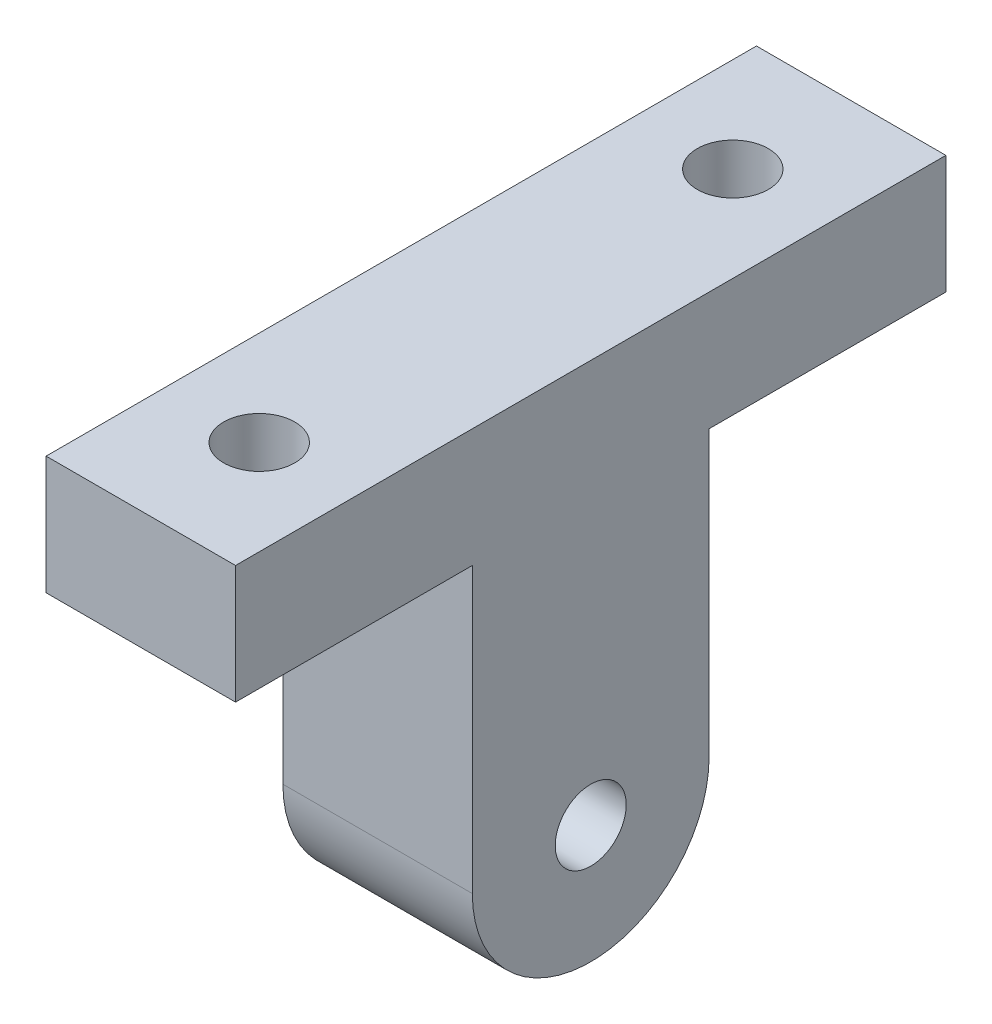
ISO-10303-21;
HEADER;
FILE_DESCRIPTION(('STEP AP214'),'2;1');
FILE_NAME('part.step','',(''),(''),'','','');
FILE_SCHEMA(('AUTOMOTIVE_DESIGN { 1 0 10303 214 1 1 1 1 }'));
ENDSEC;
DATA;
#1=APPLICATION_CONTEXT('core data for automotive mechanical design processes');
#2=APPLICATION_PROTOCOL_DEFINITION('international standard','automotive_design',2000,#1);
#3=PRODUCT_CONTEXT('',#1,'mechanical');
#4=PRODUCT('Part','Part','',(#3));
#5=PRODUCT_RELATED_PRODUCT_CATEGORY('part','',(#4));
#6=PRODUCT_DEFINITION_FORMATION('','',#4);
#7=PRODUCT_DEFINITION_CONTEXT('part definition',#1,'design');
#8=PRODUCT_DEFINITION('design','',#6,#7);
#9=PRODUCT_DEFINITION_SHAPE('','',#8);
#10=(LENGTH_UNIT() NAMED_UNIT(*) SI_UNIT(.MILLI.,.METRE.));
#11=(NAMED_UNIT(*) PLANE_ANGLE_UNIT() SI_UNIT($,.RADIAN.));
#12=(NAMED_UNIT(*) SI_UNIT($,.STERADIAN.) SOLID_ANGLE_UNIT());
#13=UNCERTAINTY_MEASURE_WITH_UNIT(LENGTH_MEASURE(1.E-05),#10,'distance_accuracy_value','');
#14=(GEOMETRIC_REPRESENTATION_CONTEXT(3) GLOBAL_UNCERTAINTY_ASSIGNED_CONTEXT((#13)) GLOBAL_UNIT_ASSIGNED_CONTEXT((#10,
#11,#12)) REPRESENTATION_CONTEXT('',''));
#15=CARTESIAN_POINT('',(0.,0.,0.));
#16=DIRECTION('',(0.,0.,1.));
#17=DIRECTION('',(1.,0.,0.));
#18=AXIS2_PLACEMENT_3D('',#15,#16,#17);
#19=CARTESIAN_POINT('',(4.,0.,0.));
#20=DIRECTION('',(1.,0.,0.));
#21=DIRECTION('',(0.,0.,-1.));
#22=AXIS2_PLACEMENT_3D('',#19,#20,#21);
#23=PLANE('',#22);
#24=CARTESIAN_POINT('',(4.,0.,0.));
#25=DIRECTION('',(1.,0.,0.));
#26=DIRECTION('',(0.,0.,-1.));
#27=AXIS2_PLACEMENT_3D('',#24,#25,#26);
#28=CIRCLE('',#27,5.);
#29=CARTESIAN_POINT('',(4.,0.,5.));
#30=VERTEX_POINT('',#29);
#31=CARTESIAN_POINT('',(4.,0.,-5.));
#32=VERTEX_POINT('',#31);
#33=EDGE_CURVE('E149',#30,#32,#28,.T.);
#34=ORIENTED_EDGE('',*,*,#33,.T.);
#35=DIRECTION('',(0.,1.,0.));
#36=VECTOR('',#35,1.);
#37=CARTESIAN_POINT('',(4.,0.,-5.));
#38=LINE('',#37,#36);
#39=CARTESIAN_POINT('',(4.,12.,-5.));
#40=VERTEX_POINT('',#39);
#41=EDGE_CURVE('E97',#32,#40,#38,.T.);
#42=ORIENTED_EDGE('',*,*,#41,.T.);
#43=DIRECTION('',(0.,0.,-1.));
#44=VECTOR('',#43,1.);
#45=CARTESIAN_POINT('',(4.,12.,-5.));
#46=LINE('',#45,#44);
#47=CARTESIAN_POINT('',(4.,12.,-15.));
#48=VERTEX_POINT('',#47);
#49=EDGE_CURVE('E164',#40,#48,#46,.T.);
#50=ORIENTED_EDGE('',*,*,#49,.T.);
#51=DIRECTION('',(0.,1.,0.));
#52=VECTOR('',#51,1.);
#53=CARTESIAN_POINT('',(4.,17.,-15.));
#54=LINE('',#53,#52);
#55=CARTESIAN_POINT('',(4.,17.,-15.));
#56=VERTEX_POINT('',#55);
#57=EDGE_CURVE('E177',#48,#56,#54,.T.);
#58=ORIENTED_EDGE('',*,*,#57,.T.);
#59=DIRECTION('',(0.,0.,1.));
#60=VECTOR('',#59,1.);
#61=CARTESIAN_POINT('',(4.,17.,15.));
#62=LINE('',#61,#60);
#63=CARTESIAN_POINT('',(4.,17.,15.));
#64=VERTEX_POINT('',#63);
#65=EDGE_CURVE('E116',#56,#64,#62,.T.);
#66=ORIENTED_EDGE('',*,*,#65,.T.);
#67=DIRECTION('',(0.,-1.,0.));
#68=VECTOR('',#67,1.);
#69=CARTESIAN_POINT('',(4.,17.,15.));
#70=LINE('',#69,#68);
#71=CARTESIAN_POINT('',(4.,12.,15.));
#72=VERTEX_POINT('',#71);
#73=EDGE_CURVE('E110',#64,#72,#70,.T.);
#74=ORIENTED_EDGE('',*,*,#73,.T.);
#75=DIRECTION('',(0.,0.,-1.));
#76=VECTOR('',#75,1.);
#77=CARTESIAN_POINT('',(4.,12.,15.));
#78=LINE('',#77,#76);
#79=CARTESIAN_POINT('',(4.,12.,5.));
#80=VERTEX_POINT('',#79);
#81=EDGE_CURVE('E114',#72,#80,#78,.T.);
#82=ORIENTED_EDGE('',*,*,#81,.T.);
#83=DIRECTION('',(0.,-1.,0.));
#84=VECTOR('',#83,1.);
#85=CARTESIAN_POINT('',(4.,0.,5.));
#86=LINE('',#85,#84);
#87=EDGE_CURVE('E54',#80,#30,#86,.T.);
#88=ORIENTED_EDGE('',*,*,#87,.T.);
#89=EDGE_LOOP('',(#34,#42,#50,#58,#66,#74,#82,#88));
#90=FACE_BOUND('',#89,.T.);
#91=CARTESIAN_POINT('',(4.,0.,0.));
#92=DIRECTION('',(1.,0.,0.));
#93=DIRECTION('',(0.,0.,-1.));
#94=AXIS2_PLACEMENT_3D('',#91,#92,#93);
#95=CIRCLE('',#94,1.5);
#96=CARTESIAN_POINT('',(4.,0.,-1.5));
#97=VERTEX_POINT('',#96);
#98=EDGE_CURVE('E138',#97,#97,#95,.T.);
#99=ORIENTED_EDGE('',*,*,#98,.F.);
#100=EDGE_LOOP('',(#99));
#101=FACE_BOUND('',#100,.T.);
#102=ADVANCED_FACE('F37',(#90,#101),#23,.T.);
#103=CARTESIAN_POINT('',(-4.,0.,0.));
#104=DIRECTION('',(1.,0.,0.));
#105=DIRECTION('',(0.,0.,-1.));
#106=AXIS2_PLACEMENT_3D('',#103,#104,#105);
#107=PLANE('',#106);
#108=CARTESIAN_POINT('',(-4.,0.,0.));
#109=DIRECTION('',(1.,0.,0.));
#110=DIRECTION('',(0.,0.,-1.));
#111=AXIS2_PLACEMENT_3D('',#108,#109,#110);
#112=CIRCLE('',#111,5.);
#113=CARTESIAN_POINT('',(-4.,0.,5.));
#114=VERTEX_POINT('',#113);
#115=CARTESIAN_POINT('',(-4.,0.,-5.));
#116=VERTEX_POINT('',#115);
#117=EDGE_CURVE('E134',#114,#116,#112,.T.);
#118=ORIENTED_EDGE('',*,*,#117,.F.);
#119=DIRECTION('',(0.,-1.,0.));
#120=VECTOR('',#119,1.);
#121=CARTESIAN_POINT('',(-4.,0.,5.));
#122=LINE('',#121,#120);
#123=CARTESIAN_POINT('',(-4.,12.,5.));
#124=VERTEX_POINT('',#123);
#125=EDGE_CURVE('E89',#124,#114,#122,.T.);
#126=ORIENTED_EDGE('',*,*,#125,.F.);
#127=DIRECTION('',(0.,0.,-1.));
#128=VECTOR('',#127,1.);
#129=CARTESIAN_POINT('',(-4.,12.,15.));
#130=LINE('',#129,#128);
#131=CARTESIAN_POINT('',(-4.,12.,15.));
#132=VERTEX_POINT('',#131);
#133=EDGE_CURVE('E83',#132,#124,#130,.T.);
#134=ORIENTED_EDGE('',*,*,#133,.F.);
#135=DIRECTION('',(0.,-1.,0.));
#136=VECTOR('',#135,1.);
#137=CARTESIAN_POINT('',(-4.,17.,15.));
#138=LINE('',#137,#136);
#139=CARTESIAN_POINT('',(-4.,17.,15.));
#140=VERTEX_POINT('',#139);
#141=EDGE_CURVE('E124',#140,#132,#138,.T.);
#142=ORIENTED_EDGE('',*,*,#141,.F.);
#143=DIRECTION('',(0.,0.,1.));
#144=VECTOR('',#143,1.);
#145=CARTESIAN_POINT('',(-4.,17.,15.));
#146=LINE('',#145,#144);
#147=CARTESIAN_POINT('',(-4.,17.,-15.));
#148=VERTEX_POINT('',#147);
#149=EDGE_CURVE('E144',#148,#140,#146,.T.);
#150=ORIENTED_EDGE('',*,*,#149,.F.);
#151=DIRECTION('',(0.,1.,0.));
#152=VECTOR('',#151,1.);
#153=CARTESIAN_POINT('',(-4.,17.,-15.));
#154=LINE('',#153,#152);
#155=CARTESIAN_POINT('',(-4.,12.,-15.));
#156=VERTEX_POINT('',#155);
#157=EDGE_CURVE('E142',#156,#148,#154,.T.);
#158=ORIENTED_EDGE('',*,*,#157,.F.);
#159=DIRECTION('',(0.,0.,-1.));
#160=VECTOR('',#159,1.);
#161=CARTESIAN_POINT('',(-4.,12.,-5.));
#162=LINE('',#161,#160);
#163=CARTESIAN_POINT('',(-4.,12.,-5.));
#164=VERTEX_POINT('',#163);
#165=EDGE_CURVE('E140',#164,#156,#162,.T.);
#166=ORIENTED_EDGE('',*,*,#165,.F.);
#167=DIRECTION('',(0.,1.,0.));
#168=VECTOR('',#167,1.);
#169=CARTESIAN_POINT('',(-4.,0.,-5.));
#170=LINE('',#169,#168);
#171=EDGE_CURVE('E137',#116,#164,#170,.T.);
#172=ORIENTED_EDGE('',*,*,#171,.F.);
#173=EDGE_LOOP('',(#118,#126,#134,#142,#150,#158,#166,#172));
#174=FACE_BOUND('',#173,.T.);
#175=CARTESIAN_POINT('',(-4.,0.,0.));
#176=DIRECTION('',(1.,0.,0.));
#177=DIRECTION('',(0.,0.,-1.));
#178=AXIS2_PLACEMENT_3D('',#175,#176,#177);
#179=CIRCLE('',#178,1.5);
#180=CARTESIAN_POINT('',(-4.,0.,-1.5));
#181=VERTEX_POINT('',#180);
#182=EDGE_CURVE('E183',#181,#181,#179,.T.);
#183=ORIENTED_EDGE('',*,*,#182,.T.);
#184=EDGE_LOOP('',(#183));
#185=FACE_BOUND('',#184,.T.);
#186=ADVANCED_FACE('F168',(#174,#185),#107,.F.);
#187=CARTESIAN_POINT('',(4.,0.,0.));
#188=DIRECTION('',(-1.,0.,0.));
#189=DIRECTION('',(0.,0.,1.));
#190=AXIS2_PLACEMENT_3D('',#187,#188,#189);
#191=CYLINDRICAL_SURFACE('',#190,5.);
#192=ORIENTED_EDGE('',*,*,#117,.T.);
#193=DIRECTION('',(-1.,0.,0.));
#194=VECTOR('',#193,1.);
#195=CARTESIAN_POINT('',(4.,0.,-5.));
#196=LINE('',#195,#194);
#197=EDGE_CURVE('E11',#32,#116,#196,.T.);
#198=ORIENTED_EDGE('',*,*,#197,.F.);
#199=ORIENTED_EDGE('',*,*,#33,.F.);
#200=DIRECTION('',(-1.,0.,0.));
#201=VECTOR('',#200,1.);
#202=CARTESIAN_POINT('',(4.,0.,5.));
#203=LINE('',#202,#201);
#204=EDGE_CURVE('E130',#30,#114,#203,.T.);
#205=ORIENTED_EDGE('',*,*,#204,.T.);
#206=EDGE_LOOP('',(#192,#198,#199,#205));
#207=FACE_BOUND('',#206,.T.);
#208=ADVANCED_FACE('F39',(#207),#191,.T.);
#209=CARTESIAN_POINT('',(4.,0.,-5.));
#210=DIRECTION('',(0.,0.,1.));
#211=DIRECTION('',(0.,-1.,0.));
#212=AXIS2_PLACEMENT_3D('',#209,#210,#211);
#213=PLANE('',#212);
#214=ORIENTED_EDGE('',*,*,#171,.T.);
#215=DIRECTION('',(-1.,0.,0.));
#216=VECTOR('',#215,1.);
#217=CARTESIAN_POINT('',(4.,12.,-5.));
#218=LINE('',#217,#216);
#219=EDGE_CURVE('E46',#40,#164,#218,.T.);
#220=ORIENTED_EDGE('',*,*,#219,.F.);
#221=ORIENTED_EDGE('',*,*,#41,.F.);
#222=ORIENTED_EDGE('',*,*,#197,.T.);
#223=EDGE_LOOP('',(#214,#220,#221,#222));
#224=FACE_BOUND('',#223,.T.);
#225=ADVANCED_FACE('F283',(#224),#213,.F.);
#226=CARTESIAN_POINT('',(4.,12.,-5.));
#227=DIRECTION('',(0.,1.,0.));
#228=DIRECTION('',(0.,0.,1.));
#229=AXIS2_PLACEMENT_3D('',#226,#227,#228);
#230=PLANE('',#229);
#231=CARTESIAN_POINT('',(0.,12.,-10.));
#232=DIRECTION('',(0.,-1.,0.));
#233=DIRECTION('',(0.,0.,1.));
#234=AXIS2_PLACEMENT_3D('',#231,#232,#233);
#235=CIRCLE('',#234,1.5);
#236=CARTESIAN_POINT('',(0.,12.,-8.5));
#237=VERTEX_POINT('',#236);
#238=EDGE_CURVE('E193',#237,#237,#235,.T.);
#239=ORIENTED_EDGE('',*,*,#238,.F.);
#240=EDGE_LOOP('',(#239));
#241=FACE_BOUND('',#240,.T.);
#242=ORIENTED_EDGE('',*,*,#165,.T.);
#243=DIRECTION('',(-1.,0.,0.));
#244=VECTOR('',#243,1.);
#245=CARTESIAN_POINT('',(4.,12.,-15.));
#246=LINE('',#245,#244);
#247=EDGE_CURVE('E156',#48,#156,#246,.T.);
#248=ORIENTED_EDGE('',*,*,#247,.F.);
#249=ORIENTED_EDGE('',*,*,#49,.F.);
#250=ORIENTED_EDGE('',*,*,#219,.T.);
#251=EDGE_LOOP('',(#242,#248,#249,#250));
#252=FACE_BOUND('',#251,.T.);
#253=ADVANCED_FACE('F162',(#241,#252),#230,.F.);
#254=CARTESIAN_POINT('',(4.,17.,-15.));
#255=DIRECTION('',(0.,0.,1.));
#256=DIRECTION('',(1.,0.,0.));
#257=AXIS2_PLACEMENT_3D('',#254,#255,#256);
#258=PLANE('',#257);
#259=ORIENTED_EDGE('',*,*,#157,.T.);
#260=DIRECTION('',(-1.,0.,0.));
#261=VECTOR('',#260,1.);
#262=CARTESIAN_POINT('',(4.,17.,-15.));
#263=LINE('',#262,#261);
#264=EDGE_CURVE('E153',#56,#148,#263,.T.);
#265=ORIENTED_EDGE('',*,*,#264,.F.);
#266=ORIENTED_EDGE('',*,*,#57,.F.);
#267=ORIENTED_EDGE('',*,*,#247,.T.);
#268=EDGE_LOOP('',(#259,#265,#266,#267));
#269=FACE_BOUND('',#268,.T.);
#270=ADVANCED_FACE('F173',(#269),#258,.F.);
#271=CARTESIAN_POINT('',(4.,17.,15.));
#272=DIRECTION('',(0.,-1.,0.));
#273=DIRECTION('',(0.,0.,-1.));
#274=AXIS2_PLACEMENT_3D('',#271,#272,#273);
#275=PLANE('',#274);
#276=CARTESIAN_POINT('',(0.,17.,10.));
#277=DIRECTION('',(0.,-1.,0.));
#278=DIRECTION('',(0.,0.,-1.));
#279=AXIS2_PLACEMENT_3D('',#276,#277,#278);
#280=CIRCLE('',#279,1.5);
#281=CARTESIAN_POINT('',(0.,17.,8.5));
#282=VERTEX_POINT('',#281);
#283=EDGE_CURVE('E186',#282,#282,#280,.F.);
#284=ORIENTED_EDGE('',*,*,#283,.F.);
#285=EDGE_LOOP('',(#284));
#286=FACE_BOUND('',#285,.T.);
#287=CARTESIAN_POINT('',(0.,17.,-10.));
#288=DIRECTION('',(0.,-1.,0.));
#289=DIRECTION('',(0.,0.,-1.));
#290=AXIS2_PLACEMENT_3D('',#287,#288,#289);
#291=CIRCLE('',#290,1.5);
#292=CARTESIAN_POINT('',(0.,17.,-11.5));
#293=VERTEX_POINT('',#292);
#294=EDGE_CURVE('E189',#293,#293,#291,.F.);
#295=ORIENTED_EDGE('',*,*,#294,.F.);
#296=EDGE_LOOP('',(#295));
#297=FACE_BOUND('',#296,.T.);
#298=ORIENTED_EDGE('',*,*,#149,.T.);
#299=DIRECTION('',(-1.,0.,0.));
#300=VECTOR('',#299,1.);
#301=CARTESIAN_POINT('',(4.,17.,15.));
#302=LINE('',#301,#300);
#303=EDGE_CURVE('E125',#64,#140,#302,.T.);
#304=ORIENTED_EDGE('',*,*,#303,.F.);
#305=ORIENTED_EDGE('',*,*,#65,.F.);
#306=ORIENTED_EDGE('',*,*,#264,.T.);
#307=EDGE_LOOP('',(#298,#304,#305,#306));
#308=FACE_BOUND('',#307,.T.);
#309=ADVANCED_FACE('F176',(#286,#297,#308),#275,.F.);
#310=CARTESIAN_POINT('',(4.,17.,15.));
#311=DIRECTION('',(0.,0.,-1.));
#312=DIRECTION('',(-1.,0.,0.));
#313=AXIS2_PLACEMENT_3D('',#310,#311,#312);
#314=PLANE('',#313);
#315=ORIENTED_EDGE('',*,*,#141,.T.);
#316=DIRECTION('',(-1.,0.,0.));
#317=VECTOR('',#316,1.);
#318=CARTESIAN_POINT('',(4.,12.,15.));
#319=LINE('',#318,#317);
#320=EDGE_CURVE('E121',#72,#132,#319,.T.);
#321=ORIENTED_EDGE('',*,*,#320,.F.);
#322=ORIENTED_EDGE('',*,*,#73,.F.);
#323=ORIENTED_EDGE('',*,*,#303,.T.);
#324=EDGE_LOOP('',(#315,#321,#322,#323));
#325=FACE_BOUND('',#324,.T.);
#326=ADVANCED_FACE('F122',(#325),#314,.F.);
#327=CARTESIAN_POINT('',(4.,12.,15.));
#328=DIRECTION('',(0.,1.,0.));
#329=DIRECTION('',(0.,0.,1.));
#330=AXIS2_PLACEMENT_3D('',#327,#328,#329);
#331=PLANE('',#330);
#332=CARTESIAN_POINT('',(0.,12.,10.));
#333=DIRECTION('',(0.,-1.,0.));
#334=DIRECTION('',(0.,0.,-1.));
#335=AXIS2_PLACEMENT_3D('',#332,#333,#334);
#336=CIRCLE('',#335,1.5);
#337=CARTESIAN_POINT('',(0.,12.,8.5));
#338=VERTEX_POINT('',#337);
#339=EDGE_CURVE('E192',#338,#338,#336,.T.);
#340=ORIENTED_EDGE('',*,*,#339,.F.);
#341=EDGE_LOOP('',(#340));
#342=FACE_BOUND('',#341,.T.);
#343=ORIENTED_EDGE('',*,*,#133,.T.);
#344=DIRECTION('',(-1.,0.,0.));
#345=VECTOR('',#344,1.);
#346=CARTESIAN_POINT('',(4.,12.,5.));
#347=LINE('',#346,#345);
#348=EDGE_CURVE('E126',#80,#124,#347,.T.);
#349=ORIENTED_EDGE('',*,*,#348,.F.);
#350=ORIENTED_EDGE('',*,*,#81,.F.);
#351=ORIENTED_EDGE('',*,*,#320,.T.);
#352=EDGE_LOOP('',(#343,#349,#350,#351));
#353=FACE_BOUND('',#352,.T.);
#354=ADVANCED_FACE('F128',(#342,#353),#331,.F.);
#355=CARTESIAN_POINT('',(4.,0.,5.));
#356=DIRECTION('',(0.,0.,-1.));
#357=DIRECTION('',(0.,1.,0.));
#358=AXIS2_PLACEMENT_3D('',#355,#356,#357);
#359=PLANE('',#358);
#360=ORIENTED_EDGE('',*,*,#125,.T.);
#361=ORIENTED_EDGE('',*,*,#204,.F.);
#362=ORIENTED_EDGE('',*,*,#87,.F.);
#363=ORIENTED_EDGE('',*,*,#348,.T.);
#364=EDGE_LOOP('',(#360,#361,#362,#363));
#365=FACE_BOUND('',#364,.T.);
#366=ADVANCED_FACE('F205',(#365),#359,.F.);
#367=CARTESIAN_POINT('',(4.,0.,0.));
#368=DIRECTION('',(-1.,0.,0.));
#369=DIRECTION('',(0.,0.,1.));
#370=AXIS2_PLACEMENT_3D('',#367,#368,#369);
#371=CYLINDRICAL_SURFACE('',#370,1.5);
#372=ORIENTED_EDGE('',*,*,#98,.T.);
#373=EDGE_LOOP('',(#372));
#374=FACE_BOUND('',#373,.T.);
#375=ORIENTED_EDGE('',*,*,#182,.F.);
#376=EDGE_LOOP('',(#375));
#377=FACE_BOUND('',#376,.T.);
#378=ADVANCED_FACE('F211',(#374,#377),#371,.F.);
#379=CARTESIAN_POINT('',(0.,17.001,10.));
#380=DIRECTION('',(0.,-1.,0.));
#381=DIRECTION('',(0.,0.,-1.));
#382=AXIS2_PLACEMENT_3D('',#379,#380,#381);
#383=CYLINDRICAL_SURFACE('',#382,1.5);
#384=ORIENTED_EDGE('',*,*,#339,.T.);
#385=EDGE_LOOP('',(#384));
#386=FACE_BOUND('',#385,.T.);
#387=ORIENTED_EDGE('',*,*,#283,.T.);
#388=EDGE_LOOP('',(#387));
#389=FACE_BOUND('',#388,.T.);
#390=ADVANCED_FACE('F201',(#386,#389),#383,.F.);
#391=CARTESIAN_POINT('',(0.,17.001,-10.));
#392=DIRECTION('',(0.,-1.,0.));
#393=DIRECTION('',(0.,0.,-1.));
#394=AXIS2_PLACEMENT_3D('',#391,#392,#393);
#395=CYLINDRICAL_SURFACE('',#394,1.5);
#396=ORIENTED_EDGE('',*,*,#238,.T.);
#397=EDGE_LOOP('',(#396));
#398=FACE_BOUND('',#397,.T.);
#399=ORIENTED_EDGE('',*,*,#294,.T.);
#400=EDGE_LOOP('',(#399));
#401=FACE_BOUND('',#400,.T.);
#402=ADVANCED_FACE('F224',(#398,#401),#395,.F.);
#403=CLOSED_SHELL('',(#102,#186,#208,#225,#253,#270,#309,#326,#354,#366,#378,#390,#402));
#404=MANIFOLD_SOLID_BREP('B2',#403);
#405=ADVANCED_BREP_SHAPE_REPRESENTATION('',(#18,#404),#14);
#406=SHAPE_DEFINITION_REPRESENTATION(#9,#405);
ENDSEC;
END-ISO-10303-21;
